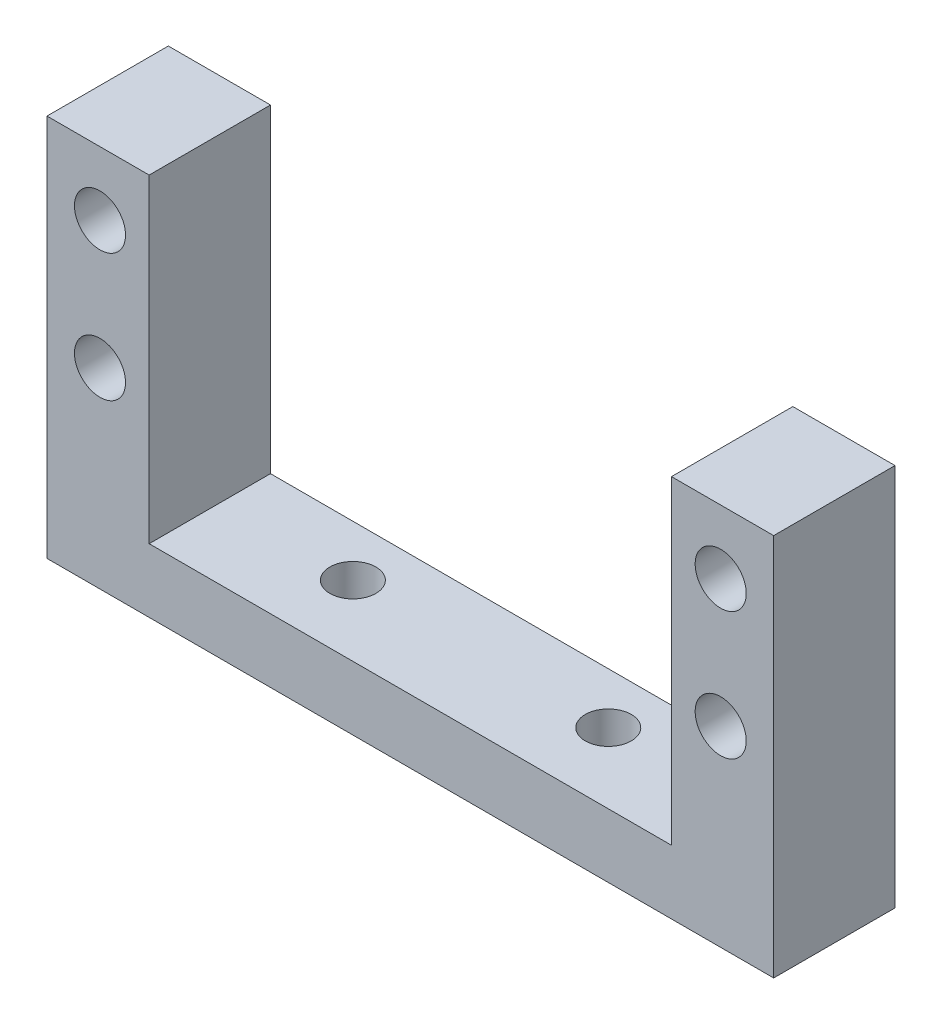
ISO-10303-21;
HEADER;
FILE_DESCRIPTION(('STEP AP214'),'2;1');
FILE_NAME('part.step','',(''),(''),'','','');
FILE_SCHEMA(('AUTOMOTIVE_DESIGN { 1 0 10303 214 1 1 1 1 }'));
ENDSEC;
DATA;
#1=APPLICATION_CONTEXT('core data for automotive mechanical design processes');
#2=APPLICATION_PROTOCOL_DEFINITION('international standard','automotive_design',2000,#1);
#3=PRODUCT_CONTEXT('',#1,'mechanical');
#4=PRODUCT('Part','Part','',(#3));
#5=PRODUCT_RELATED_PRODUCT_CATEGORY('part','',(#4));
#6=PRODUCT_DEFINITION_FORMATION('','',#4);
#7=PRODUCT_DEFINITION_CONTEXT('part definition',#1,'design');
#8=PRODUCT_DEFINITION('design','',#6,#7);
#9=PRODUCT_DEFINITION_SHAPE('','',#8);
#10=(LENGTH_UNIT() NAMED_UNIT(*) SI_UNIT(.MILLI.,.METRE.));
#11=(NAMED_UNIT(*) PLANE_ANGLE_UNIT() SI_UNIT($,.RADIAN.));
#12=(NAMED_UNIT(*) SI_UNIT($,.STERADIAN.) SOLID_ANGLE_UNIT());
#13=UNCERTAINTY_MEASURE_WITH_UNIT(LENGTH_MEASURE(1.E-05),#10,'distance_accuracy_value','');
#14=(GEOMETRIC_REPRESENTATION_CONTEXT(3) GLOBAL_UNCERTAINTY_ASSIGNED_CONTEXT((#13)) GLOBAL_UNIT_ASSIGNED_CONTEXT((#10,
#11,#12)) REPRESENTATION_CONTEXT('',''));
#15=CARTESIAN_POINT('',(0.,0.,0.));
#16=DIRECTION('',(0.,0.,1.));
#17=DIRECTION('',(1.,0.,0.));
#18=AXIS2_PLACEMENT_3D('',#15,#16,#17);
#19=CARTESIAN_POINT('',(0.,0.,11.));
#20=DIRECTION('',(0.,1.,0.));
#21=DIRECTION('',(-1.,0.,0.));
#22=AXIS2_PLACEMENT_3D('',#19,#20,#21);
#23=PLANE('',#22);
#24=CARTESIAN_POINT('',(18.45,0.,4.));
#25=DIRECTION('',(0.,-1.,0.));
#26=DIRECTION('',(1.,0.,0.));
#27=AXIS2_PLACEMENT_3D('',#24,#25,#26);
#28=CIRCLE('',#27,1.8);
#29=CARTESIAN_POINT('',(20.25,0.,4.));
#30=VERTEX_POINT('',#29);
#31=EDGE_CURVE('E157',#30,#30,#28,.T.);
#32=ORIENTED_EDGE('',*,*,#31,.F.);
#33=EDGE_LOOP('',(#32));
#34=FACE_BOUND('',#33,.T.);
#35=CARTESIAN_POINT('',(38.45,0.,4.));
#36=DIRECTION('',(0.,-1.,0.));
#37=DIRECTION('',(1.,0.,0.));
#38=AXIS2_PLACEMENT_3D('',#35,#36,#37);
#39=CIRCLE('',#38,1.8);
#40=CARTESIAN_POINT('',(40.25,0.,4.));
#41=VERTEX_POINT('',#40);
#42=EDGE_CURVE('E171',#41,#41,#39,.T.);
#43=ORIENTED_EDGE('',*,*,#42,.F.);
#44=EDGE_LOOP('',(#43));
#45=FACE_BOUND('',#44,.T.);
#46=DIRECTION('',(0.,0.,-1.));
#47=VECTOR('',#46,1.);
#48=CARTESIAN_POINT('',(56.9,0.,11.));
#49=LINE('',#48,#47);
#50=CARTESIAN_POINT('',(56.9,0.,9.5));
#51=VERTEX_POINT('',#50);
#52=CARTESIAN_POINT('',(56.9,0.,0.));
#53=VERTEX_POINT('',#52);
#54=EDGE_CURVE('E11',#51,#53,#49,.T.);
#55=ORIENTED_EDGE('',*,*,#54,.F.);
#56=DIRECTION('',(1.,0.,0.));
#57=VECTOR('',#56,1.);
#58=CARTESIAN_POINT('',(0.,0.,9.5));
#59=LINE('',#58,#57);
#60=CARTESIAN_POINT('',(0.,0.,9.5));
#61=VERTEX_POINT('',#60);
#62=EDGE_CURVE('E112',#61,#51,#59,.T.);
#63=ORIENTED_EDGE('',*,*,#62,.F.);
#64=DIRECTION('',(0.,0.,-1.));
#65=VECTOR('',#64,1.);
#66=CARTESIAN_POINT('',(0.,0.,11.));
#67=LINE('',#66,#65);
#68=CARTESIAN_POINT('',(0.,0.,0.));
#69=VERTEX_POINT('',#68);
#70=EDGE_CURVE('E69',#61,#69,#67,.T.);
#71=ORIENTED_EDGE('',*,*,#70,.T.);
#72=DIRECTION('',(1.,0.,0.));
#73=VECTOR('',#72,1.);
#74=CARTESIAN_POINT('',(0.,0.,0.));
#75=LINE('',#74,#73);
#76=EDGE_CURVE('E160',#69,#53,#75,.T.);
#77=ORIENTED_EDGE('',*,*,#76,.T.);
#78=EDGE_LOOP('',(#55,#63,#71,#77));
#79=FACE_BOUND('',#78,.T.);
#80=ADVANCED_FACE('F44',(#34,#45,#79),#23,.F.);
#81=CARTESIAN_POINT('',(56.9,0.,11.));
#82=DIRECTION('',(-1.,0.,0.));
#83=DIRECTION('',(0.,-1.,0.));
#84=AXIS2_PLACEMENT_3D('',#81,#82,#83);
#85=PLANE('',#84);
#86=DIRECTION('',(0.,0.,-1.));
#87=VECTOR('',#86,1.);
#88=CARTESIAN_POINT('',(56.9,30.,11.));
#89=LINE('',#88,#87);
#90=CARTESIAN_POINT('',(56.9,30.,9.5));
#91=VERTEX_POINT('',#90);
#92=CARTESIAN_POINT('',(56.9,30.,0.));
#93=VERTEX_POINT('',#92);
#94=EDGE_CURVE('E53',#91,#93,#89,.T.);
#95=ORIENTED_EDGE('',*,*,#94,.F.);
#96=DIRECTION('',(0.,1.,0.));
#97=VECTOR('',#96,1.);
#98=CARTESIAN_POINT('',(56.9,30.,9.5));
#99=LINE('',#98,#97);
#100=EDGE_CURVE('E121',#51,#91,#99,.T.);
#101=ORIENTED_EDGE('',*,*,#100,.F.);
#102=ORIENTED_EDGE('',*,*,#54,.T.);
#103=DIRECTION('',(0.,1.,0.));
#104=VECTOR('',#103,1.);
#105=CARTESIAN_POINT('',(56.9,0.,0.));
#106=LINE('',#105,#104);
#107=EDGE_CURVE('E164',#53,#93,#106,.T.);
#108=ORIENTED_EDGE('',*,*,#107,.T.);
#109=EDGE_LOOP('',(#95,#101,#102,#108));
#110=FACE_BOUND('',#109,.T.);
#111=ADVANCED_FACE('F228',(#110),#85,.F.);
#112=CARTESIAN_POINT('',(0.,30.,11.));
#113=DIRECTION('',(0.,1.,0.));
#114=DIRECTION('',(-1.,0.,0.));
#115=AXIS2_PLACEMENT_3D('',#112,#113,#114);
#116=PLANE('',#115);
#117=DIRECTION('',(-1.,0.,0.));
#118=VECTOR('',#117,1.);
#119=CARTESIAN_POINT('',(0.,30.,9.5));
#120=LINE('',#119,#118);
#121=CARTESIAN_POINT('',(48.9,30.,9.5));
#122=VERTEX_POINT('',#121);
#123=EDGE_CURVE('E117',#91,#122,#120,.T.);
#124=ORIENTED_EDGE('',*,*,#123,.F.);
#125=ORIENTED_EDGE('',*,*,#94,.T.);
#126=DIRECTION('',(1.,0.,0.));
#127=VECTOR('',#126,1.);
#128=CARTESIAN_POINT('',(0.,30.,0.));
#129=LINE('',#128,#127);
#130=CARTESIAN_POINT('',(48.9,30.,0.));
#131=VERTEX_POINT('',#130);
#132=EDGE_CURVE('E168',#131,#93,#129,.T.);
#133=ORIENTED_EDGE('',*,*,#132,.F.);
#134=DIRECTION('',(0.,0.,-1.));
#135=VECTOR('',#134,1.);
#136=CARTESIAN_POINT('',(48.9,30.,11.));
#137=LINE('',#136,#135);
#138=EDGE_CURVE('E148',#122,#131,#137,.T.);
#139=ORIENTED_EDGE('',*,*,#138,.F.);
#140=EDGE_LOOP('',(#124,#125,#133,#139));
#141=FACE_BOUND('',#140,.T.);
#142=ADVANCED_FACE('F234',(#141),#116,.T.);
#143=CARTESIAN_POINT('',(48.9,0.,11.));
#144=DIRECTION('',(-1.,0.,0.));
#145=DIRECTION('',(0.,-1.,0.));
#146=AXIS2_PLACEMENT_3D('',#143,#144,#145);
#147=PLANE('',#146);
#148=DIRECTION('',(0.,-1.,0.));
#149=VECTOR('',#148,1.);
#150=CARTESIAN_POINT('',(48.9,0.,9.5));
#151=LINE('',#150,#149);
#152=CARTESIAN_POINT('',(48.9,5.,9.5));
#153=VERTEX_POINT('',#152);
#154=EDGE_CURVE('E243',#122,#153,#151,.T.);
#155=ORIENTED_EDGE('',*,*,#154,.F.);
#156=ORIENTED_EDGE('',*,*,#138,.T.);
#157=DIRECTION('',(0.,1.,0.));
#158=VECTOR('',#157,1.);
#159=CARTESIAN_POINT('',(48.9,0.,0.));
#160=LINE('',#159,#158);
#161=CARTESIAN_POINT('',(48.9,5.,0.));
#162=VERTEX_POINT('',#161);
#163=EDGE_CURVE('E177',#162,#131,#160,.T.);
#164=ORIENTED_EDGE('',*,*,#163,.F.);
#165=DIRECTION('',(0.,0.,-1.));
#166=VECTOR('',#165,1.);
#167=CARTESIAN_POINT('',(48.9,5.,11.));
#168=LINE('',#167,#166);
#169=EDGE_CURVE('E145',#153,#162,#168,.T.);
#170=ORIENTED_EDGE('',*,*,#169,.F.);
#171=EDGE_LOOP('',(#155,#156,#164,#170));
#172=FACE_BOUND('',#171,.T.);
#173=ADVANCED_FACE('F279',(#172),#147,.T.);
#174=CARTESIAN_POINT('',(0.,5.,11.));
#175=DIRECTION('',(0.,1.,0.));
#176=DIRECTION('',(0.,0.,1.));
#177=AXIS2_PLACEMENT_3D('',#174,#175,#176);
#178=PLANE('',#177);
#179=DIRECTION('',(-1.,0.,0.));
#180=VECTOR('',#179,1.);
#181=CARTESIAN_POINT('',(0.,5.,9.5));
#182=LINE('',#181,#180);
#183=CARTESIAN_POINT('',(8.,5.,9.5));
#184=VERTEX_POINT('',#183);
#185=EDGE_CURVE('E246',#153,#184,#182,.T.);
#186=ORIENTED_EDGE('',*,*,#185,.F.);
#187=ORIENTED_EDGE('',*,*,#169,.T.);
#188=DIRECTION('',(1.,0.,0.));
#189=VECTOR('',#188,1.);
#190=CARTESIAN_POINT('',(0.,5.,0.));
#191=LINE('',#190,#189);
#192=CARTESIAN_POINT('',(8.,5.,0.));
#193=VERTEX_POINT('',#192);
#194=EDGE_CURVE('E181',#193,#162,#191,.T.);
#195=ORIENTED_EDGE('',*,*,#194,.F.);
#196=DIRECTION('',(0.,0.,-1.));
#197=VECTOR('',#196,1.);
#198=CARTESIAN_POINT('',(8.,5.,11.));
#199=LINE('',#198,#197);
#200=EDGE_CURVE('E142',#184,#193,#199,.T.);
#201=ORIENTED_EDGE('',*,*,#200,.F.);
#202=EDGE_LOOP('',(#186,#187,#195,#201));
#203=FACE_BOUND('',#202,.T.);
#204=CARTESIAN_POINT('',(18.45,5.,4.));
#205=DIRECTION('',(0.,1.,0.));
#206=DIRECTION('',(0.,0.,1.));
#207=AXIS2_PLACEMENT_3D('',#204,#205,#206);
#208=CIRCLE('',#207,1.8);
#209=CARTESIAN_POINT('',(18.45,5.,5.8));
#210=VERTEX_POINT('',#209);
#211=EDGE_CURVE('E156',#210,#210,#208,.T.);
#212=ORIENTED_EDGE('',*,*,#211,.F.);
#213=EDGE_LOOP('',(#212));
#214=FACE_BOUND('',#213,.T.);
#215=CARTESIAN_POINT('',(38.45,5.,4.));
#216=DIRECTION('',(0.,1.,0.));
#217=DIRECTION('',(0.,0.,1.));
#218=AXIS2_PLACEMENT_3D('',#215,#216,#217);
#219=CIRCLE('',#218,1.8);
#220=CARTESIAN_POINT('',(38.45,5.,5.8));
#221=VERTEX_POINT('',#220);
#222=EDGE_CURVE('E153',#221,#221,#219,.T.);
#223=ORIENTED_EDGE('',*,*,#222,.F.);
#224=EDGE_LOOP('',(#223));
#225=FACE_BOUND('',#224,.T.);
#226=ADVANCED_FACE('F289',(#203,#214,#225),#178,.T.);
#227=CARTESIAN_POINT('',(8.,0.,11.));
#228=DIRECTION('',(-1.,0.,0.));
#229=DIRECTION('',(0.,0.,1.));
#230=AXIS2_PLACEMENT_3D('',#227,#228,#229);
#231=PLANE('',#230);
#232=DIRECTION('',(0.,0.,-1.));
#233=VECTOR('',#232,1.);
#234=CARTESIAN_POINT('',(8.,30.,11.));
#235=LINE('',#234,#233);
#236=CARTESIAN_POINT('',(8.,30.,9.5));
#237=VERTEX_POINT('',#236);
#238=CARTESIAN_POINT('',(8.,30.,0.));
#239=VERTEX_POINT('',#238);
#240=EDGE_CURVE('E133',#237,#239,#235,.T.);
#241=ORIENTED_EDGE('',*,*,#240,.F.);
#242=DIRECTION('',(0.,-1.,0.));
#243=VECTOR('',#242,1.);
#244=CARTESIAN_POINT('',(8.,0.,9.5));
#245=LINE('',#244,#243);
#246=EDGE_CURVE('E251',#237,#184,#245,.T.);
#247=ORIENTED_EDGE('',*,*,#246,.T.);
#248=ORIENTED_EDGE('',*,*,#200,.T.);
#249=DIRECTION('',(0.,1.,0.));
#250=VECTOR('',#249,1.);
#251=CARTESIAN_POINT('',(8.,0.,0.));
#252=LINE('',#251,#250);
#253=EDGE_CURVE('E185',#193,#239,#252,.T.);
#254=ORIENTED_EDGE('',*,*,#253,.T.);
#255=EDGE_LOOP('',(#241,#247,#248,#254));
#256=FACE_BOUND('',#255,.T.);
#257=ADVANCED_FACE('F222',(#256),#231,.F.);
#258=CARTESIAN_POINT('',(0.,30.,11.));
#259=DIRECTION('',(0.,1.,0.));
#260=DIRECTION('',(0.,0.,1.));
#261=AXIS2_PLACEMENT_3D('',#258,#259,#260);
#262=PLANE('',#261);
#263=CARTESIAN_POINT('',(0.,30.,9.5));
#264=VERTEX_POINT('',#263);
#265=EDGE_CURVE('E61',#237,#264,#120,.T.);
#266=ORIENTED_EDGE('',*,*,#265,.F.);
#267=ORIENTED_EDGE('',*,*,#240,.T.);
#268=DIRECTION('',(1.,0.,0.));
#269=VECTOR('',#268,1.);
#270=CARTESIAN_POINT('',(0.,30.,0.));
#271=LINE('',#270,#269);
#272=CARTESIAN_POINT('',(0.,30.,0.));
#273=VERTEX_POINT('',#272);
#274=EDGE_CURVE('E189',#273,#239,#271,.T.);
#275=ORIENTED_EDGE('',*,*,#274,.F.);
#276=DIRECTION('',(0.,0.,-1.));
#277=VECTOR('',#276,1.);
#278=CARTESIAN_POINT('',(0.,30.,11.));
#279=LINE('',#278,#277);
#280=EDGE_CURVE('E128',#264,#273,#279,.T.);
#281=ORIENTED_EDGE('',*,*,#280,.F.);
#282=EDGE_LOOP('',(#266,#267,#275,#281));
#283=FACE_BOUND('',#282,.T.);
#284=ADVANCED_FACE('F212',(#283),#262,.T.);
#285=CARTESIAN_POINT('',(52.75,15.,11.));
#286=DIRECTION('',(0.,0.,-1.));
#287=DIRECTION('',(-1.,0.,0.));
#288=AXIS2_PLACEMENT_3D('',#285,#286,#287);
#289=CYLINDRICAL_SURFACE('',#288,2.);
#290=CARTESIAN_POINT('',(52.75,15.,9.5));
#291=DIRECTION('',(0.,0.,-1.));
#292=DIRECTION('',(-1.,0.,0.));
#293=AXIS2_PLACEMENT_3D('',#290,#291,#292);
#294=CIRCLE('',#293,2.);
#295=CARTESIAN_POINT('',(50.75,15.,9.5));
#296=VERTEX_POINT('',#295);
#297=EDGE_CURVE('E257',#296,#296,#294,.T.);
#298=ORIENTED_EDGE('',*,*,#297,.F.);
#299=EDGE_LOOP('',(#298));
#300=FACE_BOUND('',#299,.T.);
#301=CARTESIAN_POINT('',(52.75,15.,0.));
#302=DIRECTION('',(0.,0.,1.));
#303=DIRECTION('',(1.,0.,0.));
#304=AXIS2_PLACEMENT_3D('',#301,#302,#303);
#305=CIRCLE('',#304,2.);
#306=CARTESIAN_POINT('',(54.75,15.,0.));
#307=VERTEX_POINT('',#306);
#308=EDGE_CURVE('E136',#307,#307,#305,.T.);
#309=ORIENTED_EDGE('',*,*,#308,.F.);
#310=EDGE_LOOP('',(#309));
#311=FACE_BOUND('',#310,.T.);
#312=ADVANCED_FACE('F209',(#300,#311),#289,.F.);
#313=CARTESIAN_POINT('',(4.15,25.,11.));
#314=DIRECTION('',(0.,0.,-1.));
#315=DIRECTION('',(-1.,0.,0.));
#316=AXIS2_PLACEMENT_3D('',#313,#314,#315);
#317=CYLINDRICAL_SURFACE('',#316,2.);
#318=CARTESIAN_POINT('',(4.15,25.,9.5));
#319=DIRECTION('',(0.,0.,-1.));
#320=DIRECTION('',(-1.,0.,0.));
#321=AXIS2_PLACEMENT_3D('',#318,#319,#320);
#322=CIRCLE('',#321,2.);
#323=CARTESIAN_POINT('',(2.15,25.,9.5));
#324=VERTEX_POINT('',#323);
#325=EDGE_CURVE('E261',#324,#324,#322,.T.);
#326=ORIENTED_EDGE('',*,*,#325,.F.);
#327=EDGE_LOOP('',(#326));
#328=FACE_BOUND('',#327,.T.);
#329=CARTESIAN_POINT('',(4.15,25.,0.));
#330=DIRECTION('',(0.,0.,1.));
#331=DIRECTION('',(1.,0.,0.));
#332=AXIS2_PLACEMENT_3D('',#329,#330,#331);
#333=CIRCLE('',#332,2.);
#334=CARTESIAN_POINT('',(6.15,25.,0.));
#335=VERTEX_POINT('',#334);
#336=EDGE_CURVE('E199',#335,#335,#333,.T.);
#337=ORIENTED_EDGE('',*,*,#336,.F.);
#338=EDGE_LOOP('',(#337));
#339=FACE_BOUND('',#338,.T.);
#340=ADVANCED_FACE('F211',(#328,#339),#317,.F.);
#341=CARTESIAN_POINT('',(4.15,15.,11.));
#342=DIRECTION('',(0.,0.,-1.));
#343=DIRECTION('',(-1.,0.,0.));
#344=AXIS2_PLACEMENT_3D('',#341,#342,#343);
#345=CYLINDRICAL_SURFACE('',#344,2.);
#346=CARTESIAN_POINT('',(4.15,15.,9.5));
#347=DIRECTION('',(0.,0.,-1.));
#348=DIRECTION('',(-1.,0.,0.));
#349=AXIS2_PLACEMENT_3D('',#346,#347,#348);
#350=CIRCLE('',#349,2.);
#351=CARTESIAN_POINT('',(2.15,15.,9.5));
#352=VERTEX_POINT('',#351);
#353=EDGE_CURVE('E265',#352,#352,#350,.T.);
#354=ORIENTED_EDGE('',*,*,#353,.F.);
#355=EDGE_LOOP('',(#354));
#356=FACE_BOUND('',#355,.T.);
#357=CARTESIAN_POINT('',(4.15,15.,0.));
#358=DIRECTION('',(0.,0.,1.));
#359=DIRECTION('',(1.,0.,0.));
#360=AXIS2_PLACEMENT_3D('',#357,#358,#359);
#361=CIRCLE('',#360,2.);
#362=CARTESIAN_POINT('',(6.15,15.,0.));
#363=VERTEX_POINT('',#362);
#364=EDGE_CURVE('E195',#363,#363,#361,.T.);
#365=ORIENTED_EDGE('',*,*,#364,.F.);
#366=EDGE_LOOP('',(#365));
#367=FACE_BOUND('',#366,.T.);
#368=ADVANCED_FACE('F219',(#356,#367),#345,.F.);
#369=CARTESIAN_POINT('',(0.,0.,11.));
#370=DIRECTION('',(-1.,0.,0.));
#371=DIRECTION('',(0.,0.,1.));
#372=AXIS2_PLACEMENT_3D('',#369,#370,#371);
#373=PLANE('',#372);
#374=DIRECTION('',(0.,-1.,0.));
#375=VECTOR('',#374,1.);
#376=CARTESIAN_POINT('',(0.,30.,9.5));
#377=LINE('',#376,#375);
#378=EDGE_CURVE('E109',#264,#61,#377,.T.);
#379=ORIENTED_EDGE('',*,*,#378,.F.);
#380=ORIENTED_EDGE('',*,*,#280,.T.);
#381=DIRECTION('',(0.,1.,0.));
#382=VECTOR('',#381,1.);
#383=CARTESIAN_POINT('',(0.,0.,0.));
#384=LINE('',#383,#382);
#385=EDGE_CURVE('E126',#69,#273,#384,.T.);
#386=ORIENTED_EDGE('',*,*,#385,.F.);
#387=ORIENTED_EDGE('',*,*,#70,.F.);
#388=EDGE_LOOP('',(#379,#380,#386,#387));
#389=FACE_BOUND('',#388,.T.);
#390=ADVANCED_FACE('F124',(#389),#373,.T.);
#391=CARTESIAN_POINT('',(52.75,25.,11.));
#392=DIRECTION('',(0.,0.,-1.));
#393=DIRECTION('',(-1.,0.,0.));
#394=AXIS2_PLACEMENT_3D('',#391,#392,#393);
#395=CYLINDRICAL_SURFACE('',#394,2.);
#396=CARTESIAN_POINT('',(52.75,25.,9.5));
#397=DIRECTION('',(0.,0.,-1.));
#398=DIRECTION('',(-1.,0.,0.));
#399=AXIS2_PLACEMENT_3D('',#396,#397,#398);
#400=CIRCLE('',#399,2.);
#401=CARTESIAN_POINT('',(50.75,25.,9.5));
#402=VERTEX_POINT('',#401);
#403=EDGE_CURVE('E47',#402,#402,#400,.T.);
#404=ORIENTED_EDGE('',*,*,#403,.F.);
#405=EDGE_LOOP('',(#404));
#406=FACE_BOUND('',#405,.T.);
#407=CARTESIAN_POINT('',(52.75,25.,0.));
#408=DIRECTION('',(0.,0.,1.));
#409=DIRECTION('',(1.,0.,0.));
#410=AXIS2_PLACEMENT_3D('',#407,#408,#409);
#411=CIRCLE('',#410,2.);
#412=CARTESIAN_POINT('',(54.75,25.,0.));
#413=VERTEX_POINT('',#412);
#414=EDGE_CURVE('E129',#413,#413,#411,.T.);
#415=ORIENTED_EDGE('',*,*,#414,.F.);
#416=EDGE_LOOP('',(#415));
#417=FACE_BOUND('',#416,.T.);
#418=ADVANCED_FACE('F361',(#406,#417),#395,.F.);
#419=CARTESIAN_POINT('',(0.,0.,0.));
#420=DIRECTION('',(0.,0.,1.));
#421=DIRECTION('',(1.,0.,0.));
#422=AXIS2_PLACEMENT_3D('',#419,#420,#421);
#423=PLANE('',#422);
#424=ORIENTED_EDGE('',*,*,#76,.F.);
#425=ORIENTED_EDGE('',*,*,#385,.T.);
#426=ORIENTED_EDGE('',*,*,#274,.T.);
#427=ORIENTED_EDGE('',*,*,#253,.F.);
#428=ORIENTED_EDGE('',*,*,#194,.T.);
#429=ORIENTED_EDGE('',*,*,#163,.T.);
#430=ORIENTED_EDGE('',*,*,#132,.T.);
#431=ORIENTED_EDGE('',*,*,#107,.F.);
#432=EDGE_LOOP('',(#424,#425,#426,#427,#428,#429,#430,#431));
#433=FACE_BOUND('',#432,.T.);
#434=ORIENTED_EDGE('',*,*,#364,.T.);
#435=EDGE_LOOP('',(#434));
#436=FACE_BOUND('',#435,.T.);
#437=ORIENTED_EDGE('',*,*,#336,.T.);
#438=EDGE_LOOP('',(#437));
#439=FACE_BOUND('',#438,.T.);
#440=ORIENTED_EDGE('',*,*,#308,.T.);
#441=EDGE_LOOP('',(#440));
#442=FACE_BOUND('',#441,.T.);
#443=ORIENTED_EDGE('',*,*,#414,.T.);
#444=EDGE_LOOP('',(#443));
#445=FACE_BOUND('',#444,.T.);
#446=ADVANCED_FACE('F206',(#433,#436,#439,#442,#445),#423,.F.);
#447=CARTESIAN_POINT('',(38.45,9.,4.));
#448=DIRECTION('',(0.,-1.,0.));
#449=DIRECTION('',(1.,0.,0.));
#450=AXIS2_PLACEMENT_3D('',#447,#448,#449);
#451=CYLINDRICAL_SURFACE('',#450,1.8);
#452=ORIENTED_EDGE('',*,*,#222,.T.);
#453=EDGE_LOOP('',(#452));
#454=FACE_BOUND('',#453,.T.);
#455=ORIENTED_EDGE('',*,*,#42,.T.);
#456=EDGE_LOOP('',(#455));
#457=FACE_BOUND('',#456,.T.);
#458=ADVANCED_FACE('F380',(#454,#457),#451,.F.);
#459=CARTESIAN_POINT('',(18.45,9.,4.));
#460=DIRECTION('',(0.,-1.,0.));
#461=DIRECTION('',(1.,0.,0.));
#462=AXIS2_PLACEMENT_3D('',#459,#460,#461);
#463=CYLINDRICAL_SURFACE('',#462,1.8);
#464=ORIENTED_EDGE('',*,*,#211,.T.);
#465=EDGE_LOOP('',(#464));
#466=FACE_BOUND('',#465,.T.);
#467=ORIENTED_EDGE('',*,*,#31,.T.);
#468=EDGE_LOOP('',(#467));
#469=FACE_BOUND('',#468,.T.);
#470=ADVANCED_FACE('F387',(#466,#469),#463,.F.);
#471=CARTESIAN_POINT('',(0.,0.,9.5));
#472=DIRECTION('',(0.,0.,-1.));
#473=DIRECTION('',(-1.,0.,0.));
#474=AXIS2_PLACEMENT_3D('',#471,#472,#473);
#475=PLANE('',#474);
#476=ORIENTED_EDGE('',*,*,#154,.T.);
#477=ORIENTED_EDGE('',*,*,#185,.T.);
#478=ORIENTED_EDGE('',*,*,#246,.F.);
#479=ORIENTED_EDGE('',*,*,#265,.T.);
#480=ORIENTED_EDGE('',*,*,#378,.T.);
#481=ORIENTED_EDGE('',*,*,#62,.T.);
#482=ORIENTED_EDGE('',*,*,#100,.T.);
#483=ORIENTED_EDGE('',*,*,#123,.T.);
#484=EDGE_LOOP('',(#476,#477,#478,#479,#480,#481,#482,#483));
#485=FACE_BOUND('',#484,.T.);
#486=ORIENTED_EDGE('',*,*,#297,.T.);
#487=EDGE_LOOP('',(#486));
#488=FACE_BOUND('',#487,.T.);
#489=ORIENTED_EDGE('',*,*,#325,.T.);
#490=EDGE_LOOP('',(#489));
#491=FACE_BOUND('',#490,.T.);
#492=ORIENTED_EDGE('',*,*,#353,.T.);
#493=EDGE_LOOP('',(#492));
#494=FACE_BOUND('',#493,.T.);
#495=ORIENTED_EDGE('',*,*,#403,.T.);
#496=EDGE_LOOP('',(#495));
#497=FACE_BOUND('',#496,.T.);
#498=ADVANCED_FACE('F110',(#485,#488,#491,#494,#497),#475,.F.);
#499=CLOSED_SHELL('',(#80,#111,#142,#173,#226,#257,#284,#312,#340,#368,#390,#418,#446,#458,#470,#498));
#500=MANIFOLD_SOLID_BREP('B2',#499);
#501=ADVANCED_BREP_SHAPE_REPRESENTATION('',(#18,#500),#14);
#502=SHAPE_DEFINITION_REPRESENTATION(#9,#501);
ENDSEC;
END-ISO-10303-21;
